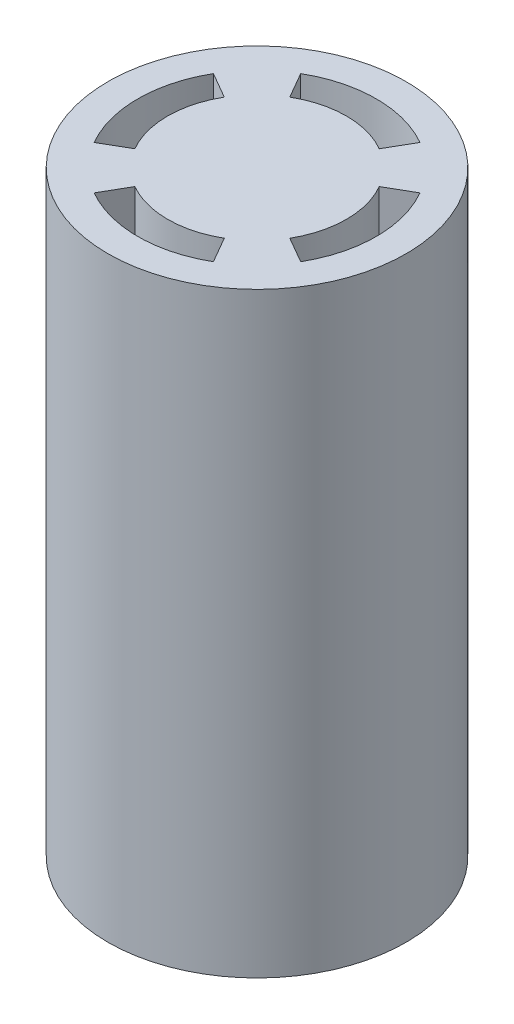
ISO-10303-21;
HEADER;
FILE_DESCRIPTION(('STEP AP214'),'2;1');
FILE_NAME('part.step','',(''),(''),'','','');
FILE_SCHEMA(('AUTOMOTIVE_DESIGN { 1 0 10303 214 1 1 1 1 }'));
ENDSEC;
DATA;
#1=APPLICATION_CONTEXT('core data for automotive mechanical design processes');
#2=APPLICATION_PROTOCOL_DEFINITION('international standard','automotive_design',2000,#1);
#3=PRODUCT_CONTEXT('',#1,'mechanical');
#4=PRODUCT('Part','Part','',(#3));
#5=PRODUCT_RELATED_PRODUCT_CATEGORY('part','',(#4));
#6=PRODUCT_DEFINITION_FORMATION('','',#4);
#7=PRODUCT_DEFINITION_CONTEXT('part definition',#1,'design');
#8=PRODUCT_DEFINITION('design','',#6,#7);
#9=PRODUCT_DEFINITION_SHAPE('','',#8);
#10=(LENGTH_UNIT() NAMED_UNIT(*) SI_UNIT(.MILLI.,.METRE.));
#11=(NAMED_UNIT(*) PLANE_ANGLE_UNIT() SI_UNIT($,.RADIAN.));
#12=(NAMED_UNIT(*) SI_UNIT($,.STERADIAN.) SOLID_ANGLE_UNIT());
#13=UNCERTAINTY_MEASURE_WITH_UNIT(LENGTH_MEASURE(1.E-05),#10,'distance_accuracy_value','');
#14=(GEOMETRIC_REPRESENTATION_CONTEXT(3) GLOBAL_UNCERTAINTY_ASSIGNED_CONTEXT((#13)) GLOBAL_UNIT_ASSIGNED_CONTEXT((#10,
#11,#12)) REPRESENTATION_CONTEXT('',''));
#15=CARTESIAN_POINT('',(0.,0.,0.));
#16=DIRECTION('',(0.,0.,1.));
#17=DIRECTION('',(1.,0.,0.));
#18=AXIS2_PLACEMENT_3D('',#15,#16,#17);
#19=CARTESIAN_POINT('',(0.,20.,0.));
#20=DIRECTION('',(0.,1.,0.));
#21=DIRECTION('',(0.,0.,1.));
#22=AXIS2_PLACEMENT_3D('',#19,#20,#21);
#23=PLANE('',#22);
#24=CARTESIAN_POINT('',(0.,20.,0.));
#25=DIRECTION('',(0.,1.,0.));
#26=DIRECTION('',(0.,0.,1.));
#27=AXIS2_PLACEMENT_3D('',#24,#25,#26);
#28=CIRCLE('',#27,5.);
#29=CARTESIAN_POINT('',(0.,20.,5.));
#30=VERTEX_POINT('',#29);
#31=EDGE_CURVE('E12',#30,#30,#28,.T.);
#32=ORIENTED_EDGE('',*,*,#31,.T.);
#33=EDGE_LOOP('',(#32));
#34=FACE_BOUND('',#33,.T.);
#35=DIRECTION('',(0.500000000000001,0.,-0.866025403784438));
#36=VECTOR('',#35,1.);
#37=CARTESIAN_POINT('',(1.5,20.,-2.59807621135331));
#38=LINE('',#37,#36);
#39=CARTESIAN_POINT('',(1.5,20.,-2.59807621135331));
#40=VERTEX_POINT('',#39);
#41=CARTESIAN_POINT('',(2.,20.,-3.46410161513775));
#42=VERTEX_POINT('',#41);
#43=EDGE_CURVE('E259',#40,#42,#38,.T.);
#44=ORIENTED_EDGE('',*,*,#43,.F.);
#45=CARTESIAN_POINT('',(0.,20.,0.));
#46=DIRECTION('',(0.,-1.,0.));
#47=DIRECTION('',(0.,0.,-1.));
#48=AXIS2_PLACEMENT_3D('',#45,#46,#47);
#49=CIRCLE('',#48,3.);
#50=CARTESIAN_POINT('',(-1.5,20.,-2.59807621135331));
#51=VERTEX_POINT('',#50);
#52=EDGE_CURVE('E257',#51,#40,#49,.T.);
#53=ORIENTED_EDGE('',*,*,#52,.F.);
#54=DIRECTION('',(0.500000000000001,0.,0.866025403784438));
#55=VECTOR('',#54,1.);
#56=CARTESIAN_POINT('',(-2.,20.,-3.46410161513775));
#57=LINE('',#56,#55);
#58=CARTESIAN_POINT('',(-2.,20.,-3.46410161513775));
#59=VERTEX_POINT('',#58);
#60=EDGE_CURVE('E265',#59,#51,#57,.T.);
#61=ORIENTED_EDGE('',*,*,#60,.F.);
#62=CARTESIAN_POINT('',(0.,20.,0.));
#63=DIRECTION('',(0.,1.,0.));
#64=DIRECTION('',(0.,0.,-1.));
#65=AXIS2_PLACEMENT_3D('',#62,#63,#64);
#66=CIRCLE('',#65,4.);
#67=EDGE_CURVE('E262',#42,#59,#66,.T.);
#68=ORIENTED_EDGE('',*,*,#67,.F.);
#69=EDGE_LOOP('',(#44,#53,#61,#68));
#70=FACE_BOUND('',#69,.T.);
#71=DIRECTION('',(0.866025403784432,0.,0.500000000000011));
#72=VECTOR('',#71,1.);
#73=CARTESIAN_POINT('',(2.5980762113533,20.,1.50000000000003));
#74=LINE('',#73,#72);
#75=CARTESIAN_POINT('',(2.5980762113533,20.,1.50000000000003));
#76=VERTEX_POINT('',#75);
#77=CARTESIAN_POINT('',(3.46410161513773,20.,2.00000000000004));
#78=VERTEX_POINT('',#77);
#79=EDGE_CURVE('E228',#76,#78,#74,.T.);
#80=ORIENTED_EDGE('',*,*,#79,.F.);
#81=CARTESIAN_POINT('',(0.,20.,0.));
#82=DIRECTION('',(0.,-1.,0.));
#83=DIRECTION('',(0.,0.,-1.));
#84=AXIS2_PLACEMENT_3D('',#81,#82,#83);
#85=CIRCLE('',#84,3.);
#86=CARTESIAN_POINT('',(2.59807621135333,20.,-1.49999999999997));
#87=VERTEX_POINT('',#86);
#88=EDGE_CURVE('E226',#87,#76,#85,.T.);
#89=ORIENTED_EDGE('',*,*,#88,.F.);
#90=DIRECTION('',(-0.866025403784443,0.,0.499999999999992));
#91=VECTOR('',#90,1.);
#92=CARTESIAN_POINT('',(3.46410161513777,20.,-1.99999999999996));
#93=LINE('',#92,#91);
#94=CARTESIAN_POINT('',(3.46410161513777,20.,-1.99999999999996));
#95=VERTEX_POINT('',#94);
#96=EDGE_CURVE('E234',#95,#87,#93,.T.);
#97=ORIENTED_EDGE('',*,*,#96,.F.);
#98=CARTESIAN_POINT('',(0.,20.,0.));
#99=DIRECTION('',(0.,1.,0.));
#100=DIRECTION('',(0.,0.,-1.));
#101=AXIS2_PLACEMENT_3D('',#98,#99,#100);
#102=CIRCLE('',#101,4.);
#103=EDGE_CURVE('E231',#78,#95,#102,.T.);
#104=ORIENTED_EDGE('',*,*,#103,.F.);
#105=EDGE_LOOP('',(#80,#89,#97,#104));
#106=FACE_BOUND('',#105,.T.);
#107=DIRECTION('',(-0.866025403784386,0.,-0.500000000000092));
#108=VECTOR('',#107,1.);
#109=CARTESIAN_POINT('',(-2.59807621135337,20.,-1.49999999999991));
#110=LINE('',#109,#108);
#111=CARTESIAN_POINT('',(-2.59807621135337,20.,-1.49999999999991));
#112=VERTEX_POINT('',#111);
#113=CARTESIAN_POINT('',(-3.46410161513775,20.,-2.));
#114=VERTEX_POINT('',#113);
#115=EDGE_CURVE('E197',#112,#114,#110,.T.);
#116=ORIENTED_EDGE('',*,*,#115,.F.);
#117=CARTESIAN_POINT('',(0.,20.,0.));
#118=DIRECTION('',(0.,-1.,0.));
#119=DIRECTION('',(0.,0.,-1.));
#120=AXIS2_PLACEMENT_3D('',#117,#118,#119);
#121=CIRCLE('',#120,3.);
#122=CARTESIAN_POINT('',(-2.59807621135326,20.,1.50000000000009));
#123=VERTEX_POINT('',#122);
#124=EDGE_CURVE('E195',#123,#112,#121,.T.);
#125=ORIENTED_EDGE('',*,*,#124,.F.);
#126=DIRECTION('',(0.86602540378449,0.,-0.499999999999911));
#127=VECTOR('',#126,1.);
#128=CARTESIAN_POINT('',(-3.46410161513775,20.,2.));
#129=LINE('',#128,#127);
#130=CARTESIAN_POINT('',(-3.46410161513775,20.,2.));
#131=VERTEX_POINT('',#130);
#132=EDGE_CURVE('E203',#131,#123,#129,.T.);
#133=ORIENTED_EDGE('',*,*,#132,.F.);
#134=CARTESIAN_POINT('',(0.,20.,0.));
#135=DIRECTION('',(0.,1.,0.));
#136=DIRECTION('',(0.,0.,-1.));
#137=AXIS2_PLACEMENT_3D('',#134,#135,#136);
#138=CIRCLE('',#137,4.);
#139=EDGE_CURVE('E200',#114,#131,#138,.T.);
#140=ORIENTED_EDGE('',*,*,#139,.F.);
#141=EDGE_LOOP('',(#116,#125,#133,#140));
#142=FACE_BOUND('',#141,.T.);
#143=DIRECTION('',(-0.499999999999994,0.,0.866025403784442));
#144=VECTOR('',#143,1.);
#145=CARTESIAN_POINT('',(-1.49999999999998,20.,2.59807621135333));
#146=LINE('',#145,#144);
#147=CARTESIAN_POINT('',(-1.49999999999998,20.,2.59807621135333));
#148=VERTEX_POINT('',#147);
#149=CARTESIAN_POINT('',(-1.99999999999998,20.,3.46410161513777));
#150=VERTEX_POINT('',#149);
#151=EDGE_CURVE('E165',#148,#150,#146,.T.);
#152=ORIENTED_EDGE('',*,*,#151,.F.);
#153=CARTESIAN_POINT('',(0.,20.,0.));
#154=DIRECTION('',(0.,-1.,0.));
#155=DIRECTION('',(0.,0.,-1.));
#156=AXIS2_PLACEMENT_3D('',#153,#154,#155);
#157=CIRCLE('',#156,3.);
#158=CARTESIAN_POINT('',(1.50000000000002,20.,2.5980762113533));
#159=VERTEX_POINT('',#158);
#160=EDGE_CURVE('E157',#159,#148,#157,.T.);
#161=ORIENTED_EDGE('',*,*,#160,.F.);
#162=DIRECTION('',(-0.500000000000008,0.,-0.866025403784434));
#163=VECTOR('',#162,1.);
#164=CARTESIAN_POINT('',(2.00000000000003,20.,3.46410161513774));
#165=LINE('',#164,#163);
#166=CARTESIAN_POINT('',(2.00000000000003,20.,3.46410161513774));
#167=VERTEX_POINT('',#166);
#168=EDGE_CURVE('E179',#167,#159,#165,.T.);
#169=ORIENTED_EDGE('',*,*,#168,.F.);
#170=CARTESIAN_POINT('',(0.,20.,0.));
#171=DIRECTION('',(0.,1.,0.));
#172=DIRECTION('',(0.,0.,-1.));
#173=AXIS2_PLACEMENT_3D('',#170,#171,#172);
#174=CIRCLE('',#173,4.);
#175=EDGE_CURVE('E177',#150,#167,#174,.T.);
#176=ORIENTED_EDGE('',*,*,#175,.F.);
#177=EDGE_LOOP('',(#152,#161,#169,#176));
#178=FACE_BOUND('',#177,.T.);
#179=ADVANCED_FACE('F44',(#34,#70,#106,#142,#178),#23,.T.);
#180=CARTESIAN_POINT('',(0.,0.,0.));
#181=DIRECTION('',(0.,1.,0.));
#182=DIRECTION('',(0.,0.,1.));
#183=AXIS2_PLACEMENT_3D('',#180,#181,#182);
#184=PLANE('',#183);
#185=CARTESIAN_POINT('',(0.,0.,0.));
#186=DIRECTION('',(0.,-1.,0.));
#187=DIRECTION('',(0.,0.,-1.));
#188=AXIS2_PLACEMENT_3D('',#185,#186,#187);
#189=CIRCLE('',#188,0.75);
#190=CARTESIAN_POINT('',(0.,0.,-0.75));
#191=VERTEX_POINT('',#190);
#192=EDGE_CURVE('E405',#191,#191,#189,.T.);
#193=ORIENTED_EDGE('',*,*,#192,.F.);
#194=EDGE_LOOP('',(#193));
#195=FACE_BOUND('',#194,.T.);
#196=CARTESIAN_POINT('',(0.,0.,0.));
#197=DIRECTION('',(0.,-1.,0.));
#198=DIRECTION('',(0.,0.,-1.));
#199=AXIS2_PLACEMENT_3D('',#196,#197,#198);
#200=CIRCLE('',#199,3.);
#201=CARTESIAN_POINT('',(-2.59807621135326,0.,1.50000000000009));
#202=VERTEX_POINT('',#201);
#203=CARTESIAN_POINT('',(-2.59807621135337,0.,-1.49999999999991));
#204=VERTEX_POINT('',#203);
#205=EDGE_CURVE('E173',#202,#204,#200,.T.);
#206=ORIENTED_EDGE('',*,*,#205,.T.);
#207=DIRECTION('',(-0.866025403784386,0.,-0.500000000000092));
#208=VECTOR('',#207,1.);
#209=CARTESIAN_POINT('',(-2.59807621135337,0.,-1.49999999999991));
#210=LINE('',#209,#208);
#211=CARTESIAN_POINT('',(-3.46410161513775,0.,-2.));
#212=VERTEX_POINT('',#211);
#213=EDGE_CURVE('E208',#204,#212,#210,.T.);
#214=ORIENTED_EDGE('',*,*,#213,.T.);
#215=CARTESIAN_POINT('',(0.,0.,0.));
#216=DIRECTION('',(0.,1.,0.));
#217=DIRECTION('',(0.,0.,-1.));
#218=AXIS2_PLACEMENT_3D('',#215,#216,#217);
#219=CIRCLE('',#218,4.);
#220=CARTESIAN_POINT('',(-3.46410161513775,0.,2.));
#221=VERTEX_POINT('',#220);
#222=EDGE_CURVE('E211',#212,#221,#219,.T.);
#223=ORIENTED_EDGE('',*,*,#222,.T.);
#224=DIRECTION('',(0.86602540378449,0.,-0.499999999999911));
#225=VECTOR('',#224,1.);
#226=CARTESIAN_POINT('',(-3.46410161513775,0.,2.));
#227=LINE('',#226,#225);
#228=EDGE_CURVE('E198',#221,#202,#227,.T.);
#229=ORIENTED_EDGE('',*,*,#228,.T.);
#230=EDGE_LOOP('',(#206,#214,#223,#229));
#231=FACE_BOUND('',#230,.T.);
#232=CARTESIAN_POINT('',(0.,0.,0.));
#233=DIRECTION('',(0.,-1.,0.));
#234=DIRECTION('',(0.,0.,-1.));
#235=AXIS2_PLACEMENT_3D('',#232,#233,#234);
#236=CIRCLE('',#235,3.);
#237=CARTESIAN_POINT('',(-1.5,0.,-2.59807621135331));
#238=VERTEX_POINT('',#237);
#239=CARTESIAN_POINT('',(1.5,0.,-2.59807621135331));
#240=VERTEX_POINT('',#239);
#241=EDGE_CURVE('E256',#238,#240,#236,.T.);
#242=ORIENTED_EDGE('',*,*,#241,.T.);
#243=DIRECTION('',(0.500000000000001,0.,-0.866025403784438));
#244=VECTOR('',#243,1.);
#245=CARTESIAN_POINT('',(1.5,0.,-2.59807621135331));
#246=LINE('',#245,#244);
#247=CARTESIAN_POINT('',(2.,0.,-3.46410161513775));
#248=VERTEX_POINT('',#247);
#249=EDGE_CURVE('E270',#240,#248,#246,.T.);
#250=ORIENTED_EDGE('',*,*,#249,.T.);
#251=CARTESIAN_POINT('',(0.,0.,0.));
#252=DIRECTION('',(0.,1.,0.));
#253=DIRECTION('',(0.,0.,-1.));
#254=AXIS2_PLACEMENT_3D('',#251,#252,#253);
#255=CIRCLE('',#254,4.);
#256=CARTESIAN_POINT('',(-2.,0.,-3.46410161513775));
#257=VERTEX_POINT('',#256);
#258=EDGE_CURVE('E273',#248,#257,#255,.T.);
#259=ORIENTED_EDGE('',*,*,#258,.T.);
#260=DIRECTION('',(0.500000000000001,0.,0.866025403784438));
#261=VECTOR('',#260,1.);
#262=CARTESIAN_POINT('',(-2.,0.,-3.46410161513775));
#263=LINE('',#262,#261);
#264=EDGE_CURVE('E260',#257,#238,#263,.T.);
#265=ORIENTED_EDGE('',*,*,#264,.T.);
#266=EDGE_LOOP('',(#242,#250,#259,#265));
#267=FACE_BOUND('',#266,.T.);
#268=CARTESIAN_POINT('',(0.,0.,0.));
#269=DIRECTION('',(0.,1.,0.));
#270=DIRECTION('',(0.,0.,1.));
#271=AXIS2_PLACEMENT_3D('',#268,#269,#270);
#272=CIRCLE('',#271,5.);
#273=CARTESIAN_POINT('',(0.,0.,5.));
#274=VERTEX_POINT('',#273);
#275=EDGE_CURVE('E48',#274,#274,#272,.T.);
#276=ORIENTED_EDGE('',*,*,#275,.F.);
#277=EDGE_LOOP('',(#276));
#278=FACE_BOUND('',#277,.T.);
#279=CARTESIAN_POINT('',(0.,0.,0.));
#280=DIRECTION('',(0.,-1.,0.));
#281=DIRECTION('',(0.,0.,-1.));
#282=AXIS2_PLACEMENT_3D('',#279,#280,#281);
#283=CIRCLE('',#282,3.);
#284=CARTESIAN_POINT('',(2.59807621135333,0.,-1.49999999999997));
#285=VERTEX_POINT('',#284);
#286=CARTESIAN_POINT('',(2.5980762113533,0.,1.50000000000003));
#287=VERTEX_POINT('',#286);
#288=EDGE_CURVE('E225',#285,#287,#283,.T.);
#289=ORIENTED_EDGE('',*,*,#288,.T.);
#290=DIRECTION('',(0.866025403784432,0.,0.500000000000011));
#291=VECTOR('',#290,1.);
#292=CARTESIAN_POINT('',(2.5980762113533,0.,1.50000000000003));
#293=LINE('',#292,#291);
#294=CARTESIAN_POINT('',(3.46410161513773,0.,2.00000000000004));
#295=VERTEX_POINT('',#294);
#296=EDGE_CURVE('E239',#287,#295,#293,.T.);
#297=ORIENTED_EDGE('',*,*,#296,.T.);
#298=CARTESIAN_POINT('',(0.,0.,0.));
#299=DIRECTION('',(0.,1.,0.));
#300=DIRECTION('',(0.,0.,-1.));
#301=AXIS2_PLACEMENT_3D('',#298,#299,#300);
#302=CIRCLE('',#301,4.);
#303=CARTESIAN_POINT('',(3.46410161513777,0.,-1.99999999999996));
#304=VERTEX_POINT('',#303);
#305=EDGE_CURVE('E242',#295,#304,#302,.T.);
#306=ORIENTED_EDGE('',*,*,#305,.T.);
#307=DIRECTION('',(-0.866025403784443,0.,0.499999999999992));
#308=VECTOR('',#307,1.);
#309=CARTESIAN_POINT('',(3.46410161513777,0.,-1.99999999999996));
#310=LINE('',#309,#308);
#311=EDGE_CURVE('E229',#304,#285,#310,.T.);
#312=ORIENTED_EDGE('',*,*,#311,.T.);
#313=EDGE_LOOP('',(#289,#297,#306,#312));
#314=FACE_BOUND('',#313,.T.);
#315=CARTESIAN_POINT('',(0.,0.,0.));
#316=DIRECTION('',(0.,-1.,0.));
#317=DIRECTION('',(0.,0.,-1.));
#318=AXIS2_PLACEMENT_3D('',#315,#316,#317);
#319=CIRCLE('',#318,3.);
#320=CARTESIAN_POINT('',(1.50000000000002,0.,2.5980762113533));
#321=VERTEX_POINT('',#320);
#322=CARTESIAN_POINT('',(-1.49999999999998,0.,2.59807621135333));
#323=VERTEX_POINT('',#322);
#324=EDGE_CURVE('E67',#321,#323,#319,.T.);
#325=ORIENTED_EDGE('',*,*,#324,.T.);
#326=DIRECTION('',(-0.499999999999994,0.,0.866025403784442));
#327=VECTOR('',#326,1.);
#328=CARTESIAN_POINT('',(-1.49999999999998,0.,2.59807621135333));
#329=LINE('',#328,#327);
#330=CARTESIAN_POINT('',(-1.99999999999998,0.,3.46410161513777));
#331=VERTEX_POINT('',#330);
#332=EDGE_CURVE('E172',#323,#331,#329,.T.);
#333=ORIENTED_EDGE('',*,*,#332,.T.);
#334=CARTESIAN_POINT('',(0.,0.,0.));
#335=DIRECTION('',(0.,1.,0.));
#336=DIRECTION('',(0.,0.,-1.));
#337=AXIS2_PLACEMENT_3D('',#334,#335,#336);
#338=CIRCLE('',#337,4.);
#339=CARTESIAN_POINT('',(2.00000000000003,0.,3.46410161513774));
#340=VERTEX_POINT('',#339);
#341=EDGE_CURVE('E187',#331,#340,#338,.T.);
#342=ORIENTED_EDGE('',*,*,#341,.T.);
#343=DIRECTION('',(-0.500000000000008,0.,-0.866025403784434));
#344=VECTOR('',#343,1.);
#345=CARTESIAN_POINT('',(2.00000000000003,0.,3.46410161513774));
#346=LINE('',#345,#344);
#347=EDGE_CURVE('E166',#340,#321,#346,.T.);
#348=ORIENTED_EDGE('',*,*,#347,.T.);
#349=EDGE_LOOP('',(#325,#333,#342,#348));
#350=FACE_BOUND('',#349,.T.);
#351=ADVANCED_FACE('F292',(#195,#231,#267,#278,#314,#350),#184,.F.);
#352=CARTESIAN_POINT('',(0.,20.,0.));
#353=DIRECTION('',(0.,-1.,0.));
#354=DIRECTION('',(0.,0.,-1.));
#355=AXIS2_PLACEMENT_3D('',#352,#353,#354);
#356=CYLINDRICAL_SURFACE('',#355,5.);
#357=ORIENTED_EDGE('',*,*,#31,.F.);
#358=EDGE_LOOP('',(#357));
#359=FACE_BOUND('',#358,.T.);
#360=ORIENTED_EDGE('',*,*,#275,.T.);
#361=EDGE_LOOP('',(#360));
#362=FACE_BOUND('',#361,.T.);
#363=ADVANCED_FACE('F46',(#359,#362),#356,.T.);
#364=CARTESIAN_POINT('',(0.,20.,0.));
#365=DIRECTION('',(0.,-1.,0.));
#366=DIRECTION('',(0.,0.,-1.));
#367=AXIS2_PLACEMENT_3D('',#364,#365,#366);
#368=CYLINDRICAL_SURFACE('',#367,3.);
#369=ORIENTED_EDGE('',*,*,#241,.F.);
#370=DIRECTION('',(0.,-1.,0.));
#371=VECTOR('',#370,1.);
#372=CARTESIAN_POINT('',(-1.5,20.,-2.59807621135331));
#373=LINE('',#372,#371);
#374=EDGE_CURVE('E267',#51,#238,#373,.T.);
#375=ORIENTED_EDGE('',*,*,#374,.F.);
#376=ORIENTED_EDGE('',*,*,#52,.T.);
#377=DIRECTION('',(0.,-1.,0.));
#378=VECTOR('',#377,1.);
#379=CARTESIAN_POINT('',(1.5,20.,-2.59807621135331));
#380=LINE('',#379,#378);
#381=EDGE_CURVE('E284',#40,#240,#380,.T.);
#382=ORIENTED_EDGE('',*,*,#381,.T.);
#383=EDGE_LOOP('',(#369,#375,#376,#382));
#384=FACE_BOUND('',#383,.T.);
#385=ADVANCED_FACE('F320',(#384),#368,.T.);
#386=CARTESIAN_POINT('',(1.5,20.,-2.59807621135331));
#387=DIRECTION('',(-0.866025403784438,0.,-0.500000000000001));
#388=DIRECTION('',(-0.500000000000001,0.,0.866025403784438));
#389=AXIS2_PLACEMENT_3D('',#386,#387,#388);
#390=PLANE('',#389);
#391=ORIENTED_EDGE('',*,*,#249,.F.);
#392=ORIENTED_EDGE('',*,*,#381,.F.);
#393=ORIENTED_EDGE('',*,*,#43,.T.);
#394=DIRECTION('',(0.,-1.,0.));
#395=VECTOR('',#394,1.);
#396=CARTESIAN_POINT('',(2.,20.,-3.46410161513775));
#397=LINE('',#396,#395);
#398=EDGE_CURVE('E282',#42,#248,#397,.T.);
#399=ORIENTED_EDGE('',*,*,#398,.T.);
#400=EDGE_LOOP('',(#391,#392,#393,#399));
#401=FACE_BOUND('',#400,.T.);
#402=ADVANCED_FACE('F323',(#401),#390,.T.);
#403=CARTESIAN_POINT('',(0.,20.,0.));
#404=DIRECTION('',(0.,-1.,0.));
#405=DIRECTION('',(0.,0.,-1.));
#406=AXIS2_PLACEMENT_3D('',#403,#404,#405);
#407=CYLINDRICAL_SURFACE('',#406,4.);
#408=ORIENTED_EDGE('',*,*,#258,.F.);
#409=ORIENTED_EDGE('',*,*,#398,.F.);
#410=ORIENTED_EDGE('',*,*,#67,.T.);
#411=DIRECTION('',(0.,-1.,0.));
#412=VECTOR('',#411,1.);
#413=CARTESIAN_POINT('',(-2.,20.,-3.46410161513775));
#414=LINE('',#413,#412);
#415=EDGE_CURVE('E280',#59,#257,#414,.T.);
#416=ORIENTED_EDGE('',*,*,#415,.T.);
#417=EDGE_LOOP('',(#408,#409,#410,#416));
#418=FACE_BOUND('',#417,.T.);
#419=ADVANCED_FACE('F326',(#418),#407,.F.);
#420=CARTESIAN_POINT('',(-2.,20.,-3.46410161513775));
#421=DIRECTION('',(0.866025403784438,0.,-0.500000000000001));
#422=DIRECTION('',(-0.500000000000001,0.,-0.866025403784438));
#423=AXIS2_PLACEMENT_3D('',#420,#421,#422);
#424=PLANE('',#423);
#425=ORIENTED_EDGE('',*,*,#264,.F.);
#426=ORIENTED_EDGE('',*,*,#415,.F.);
#427=ORIENTED_EDGE('',*,*,#60,.T.);
#428=ORIENTED_EDGE('',*,*,#374,.T.);
#429=EDGE_LOOP('',(#425,#426,#427,#428));
#430=FACE_BOUND('',#429,.T.);
#431=ADVANCED_FACE('F330',(#430),#424,.T.);
#432=CARTESIAN_POINT('',(0.,20.,0.));
#433=DIRECTION('',(0.,-1.,0.));
#434=DIRECTION('',(0.,0.,-1.));
#435=AXIS2_PLACEMENT_3D('',#432,#433,#434);
#436=CYLINDRICAL_SURFACE('',#435,3.);
#437=ORIENTED_EDGE('',*,*,#288,.F.);
#438=DIRECTION('',(0.,-1.,0.));
#439=VECTOR('',#438,1.);
#440=CARTESIAN_POINT('',(2.59807621135333,20.,-1.49999999999997));
#441=LINE('',#440,#439);
#442=EDGE_CURVE('E236',#87,#285,#441,.T.);
#443=ORIENTED_EDGE('',*,*,#442,.F.);
#444=ORIENTED_EDGE('',*,*,#88,.T.);
#445=DIRECTION('',(0.,-1.,0.));
#446=VECTOR('',#445,1.);
#447=CARTESIAN_POINT('',(2.5980762113533,20.,1.50000000000003));
#448=LINE('',#447,#446);
#449=EDGE_CURVE('E253',#76,#287,#448,.T.);
#450=ORIENTED_EDGE('',*,*,#449,.T.);
#451=EDGE_LOOP('',(#437,#443,#444,#450));
#452=FACE_BOUND('',#451,.T.);
#453=ADVANCED_FACE('F334',(#452),#436,.T.);
#454=CARTESIAN_POINT('',(2.5980762113533,20.,1.50000000000003));
#455=DIRECTION('',(0.500000000000011,0.,-0.866025403784432));
#456=DIRECTION('',(-0.866025403784432,0.,-0.500000000000011));
#457=AXIS2_PLACEMENT_3D('',#454,#455,#456);
#458=PLANE('',#457);
#459=ORIENTED_EDGE('',*,*,#296,.F.);
#460=ORIENTED_EDGE('',*,*,#449,.F.);
#461=ORIENTED_EDGE('',*,*,#79,.T.);
#462=DIRECTION('',(0.,-1.,0.));
#463=VECTOR('',#462,1.);
#464=CARTESIAN_POINT('',(3.46410161513773,20.,2.00000000000004));
#465=LINE('',#464,#463);
#466=EDGE_CURVE('E251',#78,#295,#465,.T.);
#467=ORIENTED_EDGE('',*,*,#466,.T.);
#468=EDGE_LOOP('',(#459,#460,#461,#467));
#469=FACE_BOUND('',#468,.T.);
#470=ADVANCED_FACE('F338',(#469),#458,.T.);
#471=CARTESIAN_POINT('',(0.,20.,0.));
#472=DIRECTION('',(0.,-1.,0.));
#473=DIRECTION('',(0.,0.,-1.));
#474=AXIS2_PLACEMENT_3D('',#471,#472,#473);
#475=CYLINDRICAL_SURFACE('',#474,4.);
#476=ORIENTED_EDGE('',*,*,#305,.F.);
#477=ORIENTED_EDGE('',*,*,#466,.F.);
#478=ORIENTED_EDGE('',*,*,#103,.T.);
#479=DIRECTION('',(0.,-1.,0.));
#480=VECTOR('',#479,1.);
#481=CARTESIAN_POINT('',(3.46410161513777,20.,-1.99999999999996));
#482=LINE('',#481,#480);
#483=EDGE_CURVE('E249',#95,#304,#482,.T.);
#484=ORIENTED_EDGE('',*,*,#483,.T.);
#485=EDGE_LOOP('',(#476,#477,#478,#484));
#486=FACE_BOUND('',#485,.T.);
#487=ADVANCED_FACE('F342',(#486),#475,.F.);
#488=CARTESIAN_POINT('',(3.46410161513777,20.,-1.99999999999996));
#489=DIRECTION('',(0.499999999999992,0.,0.866025403784443));
#490=DIRECTION('',(0.866025403784443,0.,-0.499999999999992));
#491=AXIS2_PLACEMENT_3D('',#488,#489,#490);
#492=PLANE('',#491);
#493=ORIENTED_EDGE('',*,*,#311,.F.);
#494=ORIENTED_EDGE('',*,*,#483,.F.);
#495=ORIENTED_EDGE('',*,*,#96,.T.);
#496=ORIENTED_EDGE('',*,*,#442,.T.);
#497=EDGE_LOOP('',(#493,#494,#495,#496));
#498=FACE_BOUND('',#497,.T.);
#499=ADVANCED_FACE('F346',(#498),#492,.T.);
#500=CARTESIAN_POINT('',(0.,20.,0.));
#501=DIRECTION('',(0.,-1.,0.));
#502=DIRECTION('',(0.,0.,-1.));
#503=AXIS2_PLACEMENT_3D('',#500,#501,#502);
#504=CYLINDRICAL_SURFACE('',#503,3.);
#505=ORIENTED_EDGE('',*,*,#205,.F.);
#506=DIRECTION('',(0.,-1.,0.));
#507=VECTOR('',#506,1.);
#508=CARTESIAN_POINT('',(-2.59807621135326,20.,1.50000000000009));
#509=LINE('',#508,#507);
#510=EDGE_CURVE('E205',#123,#202,#509,.T.);
#511=ORIENTED_EDGE('',*,*,#510,.F.);
#512=ORIENTED_EDGE('',*,*,#124,.T.);
#513=DIRECTION('',(0.,-1.,0.));
#514=VECTOR('',#513,1.);
#515=CARTESIAN_POINT('',(-2.59807621135337,20.,-1.49999999999991));
#516=LINE('',#515,#514);
#517=EDGE_CURVE('E222',#112,#204,#516,.T.);
#518=ORIENTED_EDGE('',*,*,#517,.T.);
#519=EDGE_LOOP('',(#505,#511,#512,#518));
#520=FACE_BOUND('',#519,.T.);
#521=ADVANCED_FACE('F350',(#520),#504,.T.);
#522=CARTESIAN_POINT('',(-2.59807621135337,20.,-1.49999999999991));
#523=DIRECTION('',(-0.500000000000091,0.,0.866025403784386));
#524=DIRECTION('',(0.866025403784386,0.,0.500000000000092));
#525=AXIS2_PLACEMENT_3D('',#522,#523,#524);
#526=PLANE('',#525);
#527=ORIENTED_EDGE('',*,*,#213,.F.);
#528=ORIENTED_EDGE('',*,*,#517,.F.);
#529=ORIENTED_EDGE('',*,*,#115,.T.);
#530=DIRECTION('',(0.,-1.,0.));
#531=VECTOR('',#530,1.);
#532=CARTESIAN_POINT('',(-3.46410161513775,20.,-2.));
#533=LINE('',#532,#531);
#534=EDGE_CURVE('E220',#114,#212,#533,.T.);
#535=ORIENTED_EDGE('',*,*,#534,.T.);
#536=EDGE_LOOP('',(#527,#528,#529,#535));
#537=FACE_BOUND('',#536,.T.);
#538=ADVANCED_FACE('F354',(#537),#526,.T.);
#539=CARTESIAN_POINT('',(0.,20.,0.));
#540=DIRECTION('',(0.,-1.,0.));
#541=DIRECTION('',(0.,0.,-1.));
#542=AXIS2_PLACEMENT_3D('',#539,#540,#541);
#543=CYLINDRICAL_SURFACE('',#542,4.);
#544=ORIENTED_EDGE('',*,*,#222,.F.);
#545=ORIENTED_EDGE('',*,*,#534,.F.);
#546=ORIENTED_EDGE('',*,*,#139,.T.);
#547=DIRECTION('',(0.,-1.,0.));
#548=VECTOR('',#547,1.);
#549=CARTESIAN_POINT('',(-3.46410161513775,20.,2.));
#550=LINE('',#549,#548);
#551=EDGE_CURVE('E218',#131,#221,#550,.T.);
#552=ORIENTED_EDGE('',*,*,#551,.T.);
#553=EDGE_LOOP('',(#544,#545,#546,#552));
#554=FACE_BOUND('',#553,.T.);
#555=ADVANCED_FACE('F358',(#554),#543,.F.);
#556=CARTESIAN_POINT('',(-3.46410161513775,20.,2.));
#557=DIRECTION('',(-0.499999999999911,0.,-0.86602540378449));
#558=DIRECTION('',(-0.86602540378449,0.,0.499999999999911));
#559=AXIS2_PLACEMENT_3D('',#556,#557,#558);
#560=PLANE('',#559);
#561=ORIENTED_EDGE('',*,*,#228,.F.);
#562=ORIENTED_EDGE('',*,*,#551,.F.);
#563=ORIENTED_EDGE('',*,*,#132,.T.);
#564=ORIENTED_EDGE('',*,*,#510,.T.);
#565=EDGE_LOOP('',(#561,#562,#563,#564));
#566=FACE_BOUND('',#565,.T.);
#567=ADVANCED_FACE('F362',(#566),#560,.T.);
#568=CARTESIAN_POINT('',(0.,20.,0.));
#569=DIRECTION('',(0.,-1.,0.));
#570=DIRECTION('',(0.,0.,-1.));
#571=AXIS2_PLACEMENT_3D('',#568,#569,#570);
#572=CYLINDRICAL_SURFACE('',#571,3.);
#573=ORIENTED_EDGE('',*,*,#324,.F.);
#574=DIRECTION('',(0.,-1.,0.));
#575=VECTOR('',#574,1.);
#576=CARTESIAN_POINT('',(1.50000000000002,20.,2.5980762113533));
#577=LINE('',#576,#575);
#578=EDGE_CURVE('E161',#159,#321,#577,.T.);
#579=ORIENTED_EDGE('',*,*,#578,.F.);
#580=ORIENTED_EDGE('',*,*,#160,.T.);
#581=DIRECTION('',(0.,-1.,0.));
#582=VECTOR('',#581,1.);
#583=CARTESIAN_POINT('',(-1.49999999999998,20.,2.59807621135333));
#584=LINE('',#583,#582);
#585=EDGE_CURVE('E160',#148,#323,#584,.T.);
#586=ORIENTED_EDGE('',*,*,#585,.T.);
#587=EDGE_LOOP('',(#573,#579,#580,#586));
#588=FACE_BOUND('',#587,.T.);
#589=ADVANCED_FACE('F159',(#588),#572,.T.);
#590=CARTESIAN_POINT('',(-1.49999999999998,20.,2.59807621135333));
#591=DIRECTION('',(0.866025403784442,0.,0.499999999999994));
#592=DIRECTION('',(0.499999999999994,0.,-0.866025403784442));
#593=AXIS2_PLACEMENT_3D('',#590,#591,#592);
#594=PLANE('',#593);
#595=ORIENTED_EDGE('',*,*,#332,.F.);
#596=ORIENTED_EDGE('',*,*,#585,.F.);
#597=ORIENTED_EDGE('',*,*,#151,.T.);
#598=DIRECTION('',(0.,-1.,0.));
#599=VECTOR('',#598,1.);
#600=CARTESIAN_POINT('',(-1.99999999999998,20.,3.46410161513777));
#601=LINE('',#600,#599);
#602=EDGE_CURVE('E174',#150,#331,#601,.T.);
#603=ORIENTED_EDGE('',*,*,#602,.T.);
#604=EDGE_LOOP('',(#595,#596,#597,#603));
#605=FACE_BOUND('',#604,.T.);
#606=ADVANCED_FACE('F169',(#605),#594,.T.);
#607=CARTESIAN_POINT('',(0.,20.,0.));
#608=DIRECTION('',(0.,-1.,0.));
#609=DIRECTION('',(0.,0.,-1.));
#610=AXIS2_PLACEMENT_3D('',#607,#608,#609);
#611=CYLINDRICAL_SURFACE('',#610,4.);
#612=ORIENTED_EDGE('',*,*,#341,.F.);
#613=ORIENTED_EDGE('',*,*,#602,.F.);
#614=ORIENTED_EDGE('',*,*,#175,.T.);
#615=DIRECTION('',(0.,-1.,0.));
#616=VECTOR('',#615,1.);
#617=CARTESIAN_POINT('',(2.00000000000003,20.,3.46410161513774));
#618=LINE('',#617,#616);
#619=EDGE_CURVE('E59',#167,#340,#618,.T.);
#620=ORIENTED_EDGE('',*,*,#619,.T.);
#621=EDGE_LOOP('',(#612,#613,#614,#620));
#622=FACE_BOUND('',#621,.T.);
#623=ADVANCED_FACE('F301',(#622),#611,.F.);
#624=CARTESIAN_POINT('',(2.00000000000003,20.,3.46410161513774));
#625=DIRECTION('',(-0.866025403784434,0.,0.500000000000008));
#626=DIRECTION('',(0.500000000000008,0.,0.866025403784434));
#627=AXIS2_PLACEMENT_3D('',#624,#625,#626);
#628=PLANE('',#627);
#629=ORIENTED_EDGE('',*,*,#347,.F.);
#630=ORIENTED_EDGE('',*,*,#619,.F.);
#631=ORIENTED_EDGE('',*,*,#168,.T.);
#632=ORIENTED_EDGE('',*,*,#578,.T.);
#633=EDGE_LOOP('',(#629,#630,#631,#632));
#634=FACE_BOUND('',#633,.T.);
#635=ADVANCED_FACE('F298',(#634),#628,.T.);
#636=CARTESIAN_POINT('',(0.,15.,0.));
#637=DIRECTION('',(0.,1.,0.));
#638=DIRECTION('',(0.,0.,1.));
#639=AXIS2_PLACEMENT_3D('',#636,#637,#638);
#640=PLANE('',#639);
#641=CARTESIAN_POINT('',(0.,15.,0.));
#642=DIRECTION('',(0.,1.,0.));
#643=DIRECTION('',(0.,0.,1.));
#644=AXIS2_PLACEMENT_3D('',#641,#642,#643);
#645=CIRCLE('',#644,0.75);
#646=CARTESIAN_POINT('',(0.,15.,0.75));
#647=VERTEX_POINT('',#646);
#648=EDGE_CURVE('E185',#647,#647,#645,.F.);
#649=ORIENTED_EDGE('',*,*,#648,.T.);
#650=EDGE_LOOP('',(#649));
#651=FACE_BOUND('',#650,.T.);
#652=ADVANCED_FACE('F300',(#651),#640,.F.);
#653=CARTESIAN_POINT('',(0.,22.1213203435596,0.));
#654=DIRECTION('',(0.,-1.,0.));
#655=DIRECTION('',(0.,0.,-1.));
#656=AXIS2_PLACEMENT_3D('',#653,#654,#655);
#657=CYLINDRICAL_SURFACE('',#656,0.75);
#658=ORIENTED_EDGE('',*,*,#192,.T.);
#659=EDGE_LOOP('',(#658));
#660=FACE_BOUND('',#659,.T.);
#661=ORIENTED_EDGE('',*,*,#648,.F.);
#662=EDGE_LOOP('',(#661));
#663=FACE_BOUND('',#662,.T.);
#664=ADVANCED_FACE('F307',(#660,#663),#657,.F.);
#665=CLOSED_SHELL('',(#179,#351,#363,#385,#402,#419,#431,#453,#470,#487,#499,#521,#538,#555,
#567,#589,#606,#623,#635,#652,#664));
#666=MANIFOLD_SOLID_BREP('B2',#665);
#667=ADVANCED_BREP_SHAPE_REPRESENTATION('',(#18,#666),#14);
#668=SHAPE_DEFINITION_REPRESENTATION(#9,#667);
ENDSEC;
END-ISO-10303-21;
